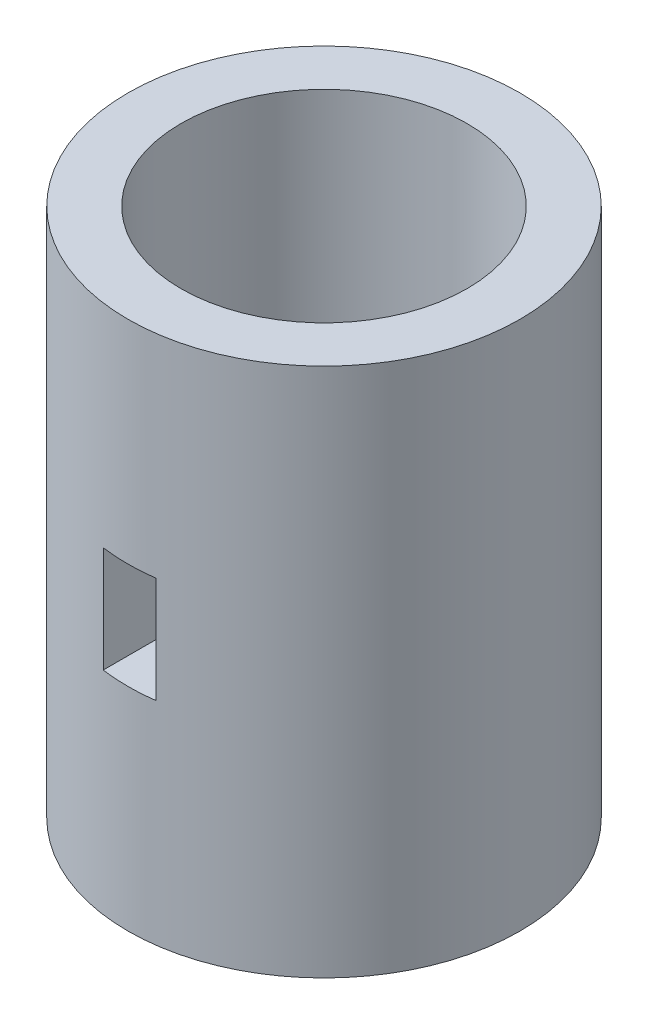
ISO-10303-21;
HEADER;
FILE_DESCRIPTION(('STEP AP214'),'2;1');
FILE_NAME('part.step','',(''),(''),'','','');
FILE_SCHEMA(('AUTOMOTIVE_DESIGN { 1 0 10303 214 1 1 1 1 }'));
ENDSEC;
DATA;
#1=APPLICATION_CONTEXT('core data for automotive mechanical design processes');
#2=APPLICATION_PROTOCOL_DEFINITION('international standard','automotive_design',2000,#1);
#3=PRODUCT_CONTEXT('',#1,'mechanical');
#4=PRODUCT('Part','Part','',(#3));
#5=PRODUCT_RELATED_PRODUCT_CATEGORY('part','',(#4));
#6=PRODUCT_DEFINITION_FORMATION('','',#4);
#7=PRODUCT_DEFINITION_CONTEXT('part definition',#1,'design');
#8=PRODUCT_DEFINITION('design','',#6,#7);
#9=PRODUCT_DEFINITION_SHAPE('','',#8);
#10=(LENGTH_UNIT() NAMED_UNIT(*) SI_UNIT(.MILLI.,.METRE.));
#11=(NAMED_UNIT(*) PLANE_ANGLE_UNIT() SI_UNIT($,.RADIAN.));
#12=(NAMED_UNIT(*) SI_UNIT($,.STERADIAN.) SOLID_ANGLE_UNIT());
#13=UNCERTAINTY_MEASURE_WITH_UNIT(LENGTH_MEASURE(1.E-05),#10,'distance_accuracy_value','');
#14=(GEOMETRIC_REPRESENTATION_CONTEXT(3) GLOBAL_UNCERTAINTY_ASSIGNED_CONTEXT((#13)) GLOBAL_UNIT_ASSIGNED_CONTEXT((#10,
#11,#12)) REPRESENTATION_CONTEXT('',''));
#15=CARTESIAN_POINT('',(0.,0.,0.));
#16=DIRECTION('',(0.,0.,1.));
#17=DIRECTION('',(1.,0.,0.));
#18=AXIS2_PLACEMENT_3D('',#15,#16,#17);
#19=CARTESIAN_POINT('',(0.,1000.,0.));
#20=DIRECTION('',(0.,-1.,0.));
#21=DIRECTION('',(0.,0.,-1.));
#22=AXIS2_PLACEMENT_3D('',#19,#20,#21);
#23=CYLINDRICAL_SURFACE('',#22,3700.);
#24=CARTESIAN_POINT('',(0.,10000.,0.));
#25=DIRECTION('',(0.,1.,0.));
#26=DIRECTION('',(0.,0.,1.));
#27=AXIS2_PLACEMENT_3D('',#24,#25,#26);
#28=CIRCLE('',#27,3700.);
#29=CARTESIAN_POINT('',(0.,10000.,3700.));
#30=VERTEX_POINT('',#29);
#31=EDGE_CURVE('E160',#30,#30,#28,.T.);
#32=ORIENTED_EDGE('',*,*,#31,.F.);
#33=EDGE_LOOP('',(#32));
#34=FACE_BOUND('',#33,.T.);
#35=CARTESIAN_POINT('',(0.,0.,0.));
#36=DIRECTION('',(0.,1.,0.));
#37=DIRECTION('',(0.,0.,1.));
#38=AXIS2_PLACEMENT_3D('',#35,#36,#37);
#39=CIRCLE('',#38,3700.);
#40=CARTESIAN_POINT('',(0.,0.,3700.));
#41=VERTEX_POINT('',#40);
#42=EDGE_CURVE('E156',#41,#41,#39,.T.);
#43=ORIENTED_EDGE('',*,*,#42,.T.);
#44=EDGE_LOOP('',(#43));
#45=FACE_BOUND('',#44,.T.);
#46=CARTESIAN_POINT('',(0.,6000.,0.));
#47=DIRECTION('',(0.,1.,0.));
#48=DIRECTION('',(0.,0.,1.));
#49=AXIS2_PLACEMENT_3D('',#46,#47,#48);
#50=CIRCLE('',#49,3700.);
#51=CARTESIAN_POINT('',(-500.,6000.,3666.06055596467));
#52=VERTEX_POINT('',#51);
#53=CARTESIAN_POINT('',(500.,6000.,3666.06055596467));
#54=VERTEX_POINT('',#53);
#55=EDGE_CURVE('E176',#52,#54,#50,.T.);
#56=ORIENTED_EDGE('',*,*,#55,.T.);
#57=DIRECTION('',(0.,-1.,0.));
#58=VECTOR('',#57,1.);
#59=CARTESIAN_POINT('',(500.,1000.,3666.06055596467));
#60=LINE('',#59,#58);
#61=CARTESIAN_POINT('',(500.,4000.,3666.06055596467));
#62=VERTEX_POINT('',#61);
#63=EDGE_CURVE('E168',#62,#54,#60,.F.);
#64=ORIENTED_EDGE('',*,*,#63,.F.);
#65=CARTESIAN_POINT('',(0.,4000.,0.));
#66=DIRECTION('',(0.,1.,0.));
#67=DIRECTION('',(0.,0.,1.));
#68=AXIS2_PLACEMENT_3D('',#65,#66,#67);
#69=CIRCLE('',#68,3700.);
#70=CARTESIAN_POINT('',(-500.,4000.,3666.06055596467));
#71=VERTEX_POINT('',#70);
#72=EDGE_CURVE('E179',#71,#62,#69,.T.);
#73=ORIENTED_EDGE('',*,*,#72,.F.);
#74=DIRECTION('',(0.,-1.,0.));
#75=VECTOR('',#74,1.);
#76=CARTESIAN_POINT('',(-500.,1000.,3666.06055596467));
#77=LINE('',#76,#75);
#78=EDGE_CURVE('E172',#52,#71,#77,.T.);
#79=ORIENTED_EDGE('',*,*,#78,.F.);
#80=EDGE_LOOP('',(#56,#64,#73,#79));
#81=FACE_BOUND('',#80,.T.);
#82=CARTESIAN_POINT('',(0.,3200.,0.));
#83=DIRECTION('',(0.,-1.,0.));
#84=DIRECTION('',(0.,0.,-1.));
#85=AXIS2_PLACEMENT_3D('',#82,#83,#84);
#86=CIRCLE('',#85,3700.);
#87=CARTESIAN_POINT('',(-3663.53028497055,3200.,518.214097746892));
#88=VERTEX_POINT('',#87);
#89=CARTESIAN_POINT('',(-3668.49864990982,3200.,-481.785902253108));
#90=VERTEX_POINT('',#89);
#91=EDGE_CURVE('E124',#88,#90,#86,.T.);
#92=ORIENTED_EDGE('',*,*,#91,.F.);
#93=DIRECTION('',(0.,-1.,0.));
#94=VECTOR('',#93,1.);
#95=CARTESIAN_POINT('',(-3663.53028497055,1000.,518.214097746892));
#96=LINE('',#95,#94);
#97=CARTESIAN_POINT('',(-3663.53028497055,1000.,518.214097746892));
#98=VERTEX_POINT('',#97);
#99=EDGE_CURVE('E11',#98,#88,#96,.F.);
#100=ORIENTED_EDGE('',*,*,#99,.F.);
#101=CARTESIAN_POINT('',(0.,1000.,0.));
#102=DIRECTION('',(0.,-1.,0.));
#103=DIRECTION('',(0.,0.,-1.));
#104=AXIS2_PLACEMENT_3D('',#101,#102,#103);
#105=CIRCLE('',#104,3700.);
#106=CARTESIAN_POINT('',(-3668.49864990982,1000.,-481.785902253108));
#107=VERTEX_POINT('',#106);
#108=EDGE_CURVE('E60',#98,#107,#105,.T.);
#109=ORIENTED_EDGE('',*,*,#108,.T.);
#110=DIRECTION('',(0.,-1.,0.));
#111=VECTOR('',#110,1.);
#112=CARTESIAN_POINT('',(-3668.49864990982,1000.,-481.785902253108));
#113=LINE('',#112,#111);
#114=EDGE_CURVE('E138',#90,#107,#113,.T.);
#115=ORIENTED_EDGE('',*,*,#114,.F.);
#116=EDGE_LOOP('',(#92,#100,#109,#115));
#117=FACE_BOUND('',#116,.T.);
#118=ADVANCED_FACE('F45',(#34,#45,#81,#117),#23,.T.);
#119=CARTESIAN_POINT('',(0.,10000.,0.));
#120=DIRECTION('',(0.,-1.,0.));
#121=DIRECTION('',(0.,0.,-1.));
#122=AXIS2_PLACEMENT_3D('',#119,#120,#121);
#123=CYLINDRICAL_SURFACE('',#122,2700.);
#124=CARTESIAN_POINT('',(0.,6000.,0.));
#125=DIRECTION('',(0.,1.,0.));
#126=DIRECTION('',(0.,0.,1.));
#127=AXIS2_PLACEMENT_3D('',#124,#125,#126);
#128=CIRCLE('',#127,2700.);
#129=CARTESIAN_POINT('',(-500.,6000.,2653.29983228432));
#130=VERTEX_POINT('',#129);
#131=CARTESIAN_POINT('',(500.,6000.,2653.29983228432));
#132=VERTEX_POINT('',#131);
#133=EDGE_CURVE('E145',#130,#132,#128,.T.);
#134=ORIENTED_EDGE('',*,*,#133,.F.);
#135=DIRECTION('',(0.,-1.,0.));
#136=VECTOR('',#135,1.);
#137=CARTESIAN_POINT('',(-500.,6000.,2653.29983228432));
#138=LINE('',#137,#136);
#139=CARTESIAN_POINT('',(-500.,4000.,2653.29983228432));
#140=VERTEX_POINT('',#139);
#141=EDGE_CURVE('E185',#130,#140,#138,.T.);
#142=ORIENTED_EDGE('',*,*,#141,.T.);
#143=CARTESIAN_POINT('',(0.,4000.,0.));
#144=DIRECTION('',(0.,1.,0.));
#145=DIRECTION('',(0.,0.,1.));
#146=AXIS2_PLACEMENT_3D('',#143,#144,#145);
#147=CIRCLE('',#146,2700.);
#148=CARTESIAN_POINT('',(499.999999999999,4000.,2653.29983228432));
#149=VERTEX_POINT('',#148);
#150=EDGE_CURVE('E147',#140,#149,#147,.T.);
#151=ORIENTED_EDGE('',*,*,#150,.T.);
#152=DIRECTION('',(0.,-1.,0.));
#153=VECTOR('',#152,1.);
#154=CARTESIAN_POINT('',(500.,6000.,2653.29983228432));
#155=LINE('',#154,#153);
#156=EDGE_CURVE('E182',#132,#149,#155,.T.);
#157=ORIENTED_EDGE('',*,*,#156,.F.);
#158=EDGE_LOOP('',(#134,#142,#151,#157));
#159=FACE_BOUND('',#158,.T.);
#160=CARTESIAN_POINT('',(0.,10000.,0.));
#161=DIRECTION('',(0.,1.,0.));
#162=DIRECTION('',(0.,0.,1.));
#163=AXIS2_PLACEMENT_3D('',#160,#161,#162);
#164=CIRCLE('',#163,2700.);
#165=CARTESIAN_POINT('',(0.,10000.,2700.));
#166=VERTEX_POINT('',#165);
#167=EDGE_CURVE('E164',#166,#166,#164,.T.);
#168=ORIENTED_EDGE('',*,*,#167,.T.);
#169=EDGE_LOOP('',(#168));
#170=FACE_BOUND('',#169,.T.);
#171=CARTESIAN_POINT('',(0.,1000.,0.));
#172=DIRECTION('',(0.,1.,0.));
#173=DIRECTION('',(0.,0.,1.));
#174=AXIS2_PLACEMENT_3D('',#171,#172,#173);
#175=CIRCLE('',#174,2700.);
#176=CARTESIAN_POINT('',(-2656.66752612933,1000.,-481.785902253108));
#177=VERTEX_POINT('',#176);
#178=CARTESIAN_POINT('',(-2656.66752612933,1000.,481.785902253107));
#179=VERTEX_POINT('',#178);
#180=EDGE_CURVE('E153',#177,#179,#175,.F.);
#181=ORIENTED_EDGE('',*,*,#180,.T.);
#182=DIRECTION('',(0.,-1.,0.));
#183=VECTOR('',#182,1.);
#184=CARTESIAN_POINT('',(-2656.66752612933,10000.,481.785902253107));
#185=LINE('',#184,#183);
#186=CARTESIAN_POINT('',(-2656.66752612933,3200.,481.785902253107));
#187=VERTEX_POINT('',#186);
#188=EDGE_CURVE('E143',#179,#187,#185,.F.);
#189=ORIENTED_EDGE('',*,*,#188,.T.);
#190=CARTESIAN_POINT('',(0.,3200.,0.));
#191=DIRECTION('',(0.,-1.,0.));
#192=DIRECTION('',(0.,0.,-1.));
#193=AXIS2_PLACEMENT_3D('',#190,#191,#192);
#194=CIRCLE('',#193,2700.);
#195=CARTESIAN_POINT('',(-2656.66752612933,3200.,-481.785902253108));
#196=VERTEX_POINT('',#195);
#197=EDGE_CURVE('E53',#187,#196,#194,.T.);
#198=ORIENTED_EDGE('',*,*,#197,.T.);
#199=DIRECTION('',(0.,-1.,0.));
#200=VECTOR('',#199,1.);
#201=CARTESIAN_POINT('',(-2656.66752612933,3200.,-481.785902253108));
#202=LINE('',#201,#200);
#203=EDGE_CURVE('E132',#196,#177,#202,.T.);
#204=ORIENTED_EDGE('',*,*,#203,.T.);
#205=EDGE_LOOP('',(#181,#189,#198,#204));
#206=FACE_BOUND('',#205,.T.);
#207=ADVANCED_FACE('F142',(#159,#170,#206),#123,.F.);
#208=CARTESIAN_POINT('',(0.,0.,0.));
#209=DIRECTION('',(0.,1.,0.));
#210=DIRECTION('',(0.,0.,1.));
#211=AXIS2_PLACEMENT_3D('',#208,#209,#210);
#212=PLANE('',#211);
#213=ORIENTED_EDGE('',*,*,#42,.F.);
#214=EDGE_LOOP('',(#213));
#215=FACE_BOUND('',#214,.T.);
#216=ADVANCED_FACE('F246',(#215),#212,.F.);
#217=CARTESIAN_POINT('',(0.,10000.,0.));
#218=DIRECTION('',(0.,1.,0.));
#219=DIRECTION('',(0.,0.,1.));
#220=AXIS2_PLACEMENT_3D('',#217,#218,#219);
#221=PLANE('',#220);
#222=ORIENTED_EDGE('',*,*,#31,.T.);
#223=EDGE_LOOP('',(#222));
#224=FACE_BOUND('',#223,.T.);
#225=ORIENTED_EDGE('',*,*,#167,.F.);
#226=EDGE_LOOP('',(#225));
#227=FACE_BOUND('',#226,.T.);
#228=ADVANCED_FACE('F235',(#224,#227),#221,.T.);
#229=CARTESIAN_POINT('',(0.,1000.,0.));
#230=DIRECTION('',(0.,1.,0.));
#231=DIRECTION('',(0.,0.,1.));
#232=AXIS2_PLACEMENT_3D('',#229,#230,#231);
#233=PLANE('',#232);
#234=ORIENTED_EDGE('',*,*,#180,.F.);
#235=DIRECTION('',(-1.,0.,0.));
#236=VECTOR('',#235,1.);
#237=CARTESIAN_POINT('',(-3700.,1000.,-481.785902253108));
#238=LINE('',#237,#236);
#239=EDGE_CURVE('E134',#177,#107,#238,.T.);
#240=ORIENTED_EDGE('',*,*,#239,.T.);
#241=ORIENTED_EDGE('',*,*,#108,.F.);
#242=DIRECTION('',(1.,0.,0.));
#243=VECTOR('',#242,1.);
#244=CARTESIAN_POINT('',(-3700.,1000.,518.214097746892));
#245=LINE('',#244,#243);
#246=CARTESIAN_POINT('',(-2656.66752612933,1000.,518.214097746892));
#247=VERTEX_POINT('',#246);
#248=EDGE_CURVE('E216',#98,#247,#245,.T.);
#249=ORIENTED_EDGE('',*,*,#248,.T.);
#250=DIRECTION('',(0.,0.,-1.));
#251=VECTOR('',#250,1.);
#252=CARTESIAN_POINT('',(-2656.66752612933,1000.,518.214097746892));
#253=LINE('',#252,#251);
#254=EDGE_CURVE('E68',#247,#179,#253,.T.);
#255=ORIENTED_EDGE('',*,*,#254,.T.);
#256=EDGE_LOOP('',(#234,#240,#241,#249,#255));
#257=FACE_BOUND('',#256,.T.);
#258=ADVANCED_FACE('F232',(#257),#233,.T.);
#259=CARTESIAN_POINT('',(500.,6000.,2653.29983228432));
#260=DIRECTION('',(-1.,0.,0.));
#261=DIRECTION('',(0.,0.,1.));
#262=AXIS2_PLACEMENT_3D('',#259,#260,#261);
#263=PLANE('',#262);
#264=ORIENTED_EDGE('',*,*,#63,.T.);
#265=DIRECTION('',(0.,0.,-1.));
#266=VECTOR('',#265,1.);
#267=CARTESIAN_POINT('',(500.,6000.,2653.29983228432));
#268=LINE('',#267,#266);
#269=EDGE_CURVE('E194',#54,#132,#268,.T.);
#270=ORIENTED_EDGE('',*,*,#269,.T.);
#271=ORIENTED_EDGE('',*,*,#156,.T.);
#272=DIRECTION('',(0.,0.,-1.));
#273=VECTOR('',#272,1.);
#274=CARTESIAN_POINT('',(500.,4000.,2653.29983228432));
#275=LINE('',#274,#273);
#276=EDGE_CURVE('E195',#62,#149,#275,.T.);
#277=ORIENTED_EDGE('',*,*,#276,.F.);
#278=EDGE_LOOP('',(#264,#270,#271,#277));
#279=FACE_BOUND('',#278,.T.);
#280=ADVANCED_FACE('F234',(#279),#263,.T.);
#281=CARTESIAN_POINT('',(-500.,6000.,2653.29983228432));
#282=DIRECTION('',(1.,0.,0.));
#283=DIRECTION('',(0.,0.,-1.));
#284=AXIS2_PLACEMENT_3D('',#281,#282,#283);
#285=PLANE('',#284);
#286=ORIENTED_EDGE('',*,*,#78,.T.);
#287=DIRECTION('',(0.,0.,1.));
#288=VECTOR('',#287,1.);
#289=CARTESIAN_POINT('',(-500.,4000.,2653.29983228432));
#290=LINE('',#289,#288);
#291=EDGE_CURVE('E190',#140,#71,#290,.T.);
#292=ORIENTED_EDGE('',*,*,#291,.F.);
#293=ORIENTED_EDGE('',*,*,#141,.F.);
#294=DIRECTION('',(0.,0.,1.));
#295=VECTOR('',#294,1.);
#296=CARTESIAN_POINT('',(-500.,6000.,2653.29983228432));
#297=LINE('',#296,#295);
#298=EDGE_CURVE('E189',#130,#52,#297,.T.);
#299=ORIENTED_EDGE('',*,*,#298,.T.);
#300=EDGE_LOOP('',(#286,#292,#293,#299));
#301=FACE_BOUND('',#300,.T.);
#302=ADVANCED_FACE('F242',(#301),#285,.T.);
#303=CARTESIAN_POINT('',(0.,6000.,0.));
#304=DIRECTION('',(0.,1.,0.));
#305=DIRECTION('',(0.,0.,1.));
#306=AXIS2_PLACEMENT_3D('',#303,#304,#305);
#307=PLANE('',#306);
#308=ORIENTED_EDGE('',*,*,#55,.F.);
#309=ORIENTED_EDGE('',*,*,#298,.F.);
#310=ORIENTED_EDGE('',*,*,#133,.T.);
#311=ORIENTED_EDGE('',*,*,#269,.F.);
#312=EDGE_LOOP('',(#308,#309,#310,#311));
#313=FACE_BOUND('',#312,.T.);
#314=ADVANCED_FACE('F267',(#313),#307,.F.);
#315=CARTESIAN_POINT('',(0.,4000.,0.));
#316=DIRECTION('',(0.,1.,0.));
#317=DIRECTION('',(0.,0.,1.));
#318=AXIS2_PLACEMENT_3D('',#315,#316,#317);
#319=PLANE('',#318);
#320=ORIENTED_EDGE('',*,*,#72,.T.);
#321=ORIENTED_EDGE('',*,*,#276,.T.);
#322=ORIENTED_EDGE('',*,*,#150,.F.);
#323=ORIENTED_EDGE('',*,*,#291,.T.);
#324=EDGE_LOOP('',(#320,#321,#322,#323));
#325=FACE_BOUND('',#324,.T.);
#326=ADVANCED_FACE('F271',(#325),#319,.T.);
#327=CARTESIAN_POINT('',(-3700.,3200.,518.214097746892));
#328=DIRECTION('',(0.,0.,-1.));
#329=DIRECTION('',(-1.,0.,0.));
#330=AXIS2_PLACEMENT_3D('',#327,#328,#329);
#331=PLANE('',#330);
#332=ORIENTED_EDGE('',*,*,#99,.T.);
#333=DIRECTION('',(1.,0.,0.));
#334=VECTOR('',#333,1.);
#335=CARTESIAN_POINT('',(-3700.,3200.,518.214097746892));
#336=LINE('',#335,#334);
#337=CARTESIAN_POINT('',(-2656.66752612933,3200.,518.214097746892));
#338=VERTEX_POINT('',#337);
#339=EDGE_CURVE('E128',#88,#338,#336,.T.);
#340=ORIENTED_EDGE('',*,*,#339,.T.);
#341=DIRECTION('',(0.,-1.,0.));
#342=VECTOR('',#341,1.);
#343=CARTESIAN_POINT('',(-2656.66752612933,3200.,518.214097746892));
#344=LINE('',#343,#342);
#345=EDGE_CURVE('E139',#338,#247,#344,.T.);
#346=ORIENTED_EDGE('',*,*,#345,.T.);
#347=ORIENTED_EDGE('',*,*,#248,.F.);
#348=EDGE_LOOP('',(#332,#340,#346,#347));
#349=FACE_BOUND('',#348,.T.);
#350=ADVANCED_FACE('F231',(#349),#331,.T.);
#351=CARTESIAN_POINT('',(0.,3200.,0.));
#352=DIRECTION('',(0.,-1.,0.));
#353=DIRECTION('',(0.,0.,-1.));
#354=AXIS2_PLACEMENT_3D('',#351,#352,#353);
#355=PLANE('',#354);
#356=ORIENTED_EDGE('',*,*,#91,.T.);
#357=DIRECTION('',(-1.,0.,0.));
#358=VECTOR('',#357,1.);
#359=CARTESIAN_POINT('',(-3700.,3200.,-481.785902253108));
#360=LINE('',#359,#358);
#361=EDGE_CURVE('E116',#196,#90,#360,.T.);
#362=ORIENTED_EDGE('',*,*,#361,.F.);
#363=ORIENTED_EDGE('',*,*,#197,.F.);
#364=DIRECTION('',(0.,0.,-1.));
#365=VECTOR('',#364,1.);
#366=CARTESIAN_POINT('',(-2656.66752612933,3200.,518.214097746892));
#367=LINE('',#366,#365);
#368=EDGE_CURVE('E129',#338,#187,#367,.T.);
#369=ORIENTED_EDGE('',*,*,#368,.F.);
#370=ORIENTED_EDGE('',*,*,#339,.F.);
#371=EDGE_LOOP('',(#356,#362,#363,#369,#370));
#372=FACE_BOUND('',#371,.T.);
#373=ADVANCED_FACE('F118',(#372),#355,.T.);
#374=CARTESIAN_POINT('',(-3700.,3200.,-481.785902253108));
#375=DIRECTION('',(0.,0.,1.));
#376=DIRECTION('',(1.,0.,0.));
#377=AXIS2_PLACEMENT_3D('',#374,#375,#376);
#378=PLANE('',#377);
#379=ORIENTED_EDGE('',*,*,#114,.T.);
#380=ORIENTED_EDGE('',*,*,#239,.F.);
#381=ORIENTED_EDGE('',*,*,#203,.F.);
#382=ORIENTED_EDGE('',*,*,#361,.T.);
#383=EDGE_LOOP('',(#379,#380,#381,#382));
#384=FACE_BOUND('',#383,.T.);
#385=ADVANCED_FACE('F133',(#384),#378,.T.);
#386=CARTESIAN_POINT('',(-2656.66752612933,3200.,518.214097746892));
#387=DIRECTION('',(-1.,0.,0.));
#388=DIRECTION('',(0.,0.,1.));
#389=AXIS2_PLACEMENT_3D('',#386,#387,#388);
#390=PLANE('',#389);
#391=ORIENTED_EDGE('',*,*,#254,.F.);
#392=ORIENTED_EDGE('',*,*,#345,.F.);
#393=ORIENTED_EDGE('',*,*,#368,.T.);
#394=ORIENTED_EDGE('',*,*,#188,.F.);
#395=EDGE_LOOP('',(#391,#392,#393,#394));
#396=FACE_BOUND('',#395,.T.);
#397=ADVANCED_FACE('F228',(#396),#390,.T.);
#398=CLOSED_SHELL('',(#118,#207,#216,#228,#258,#280,#302,#314,#326,#350,#373,#385,#397));
#399=MANIFOLD_SOLID_BREP('B2',#398);
#400=ADVANCED_BREP_SHAPE_REPRESENTATION('',(#18,#399),#14);
#401=SHAPE_DEFINITION_REPRESENTATION(#9,#400);
ENDSEC;
END-ISO-10303-21;
